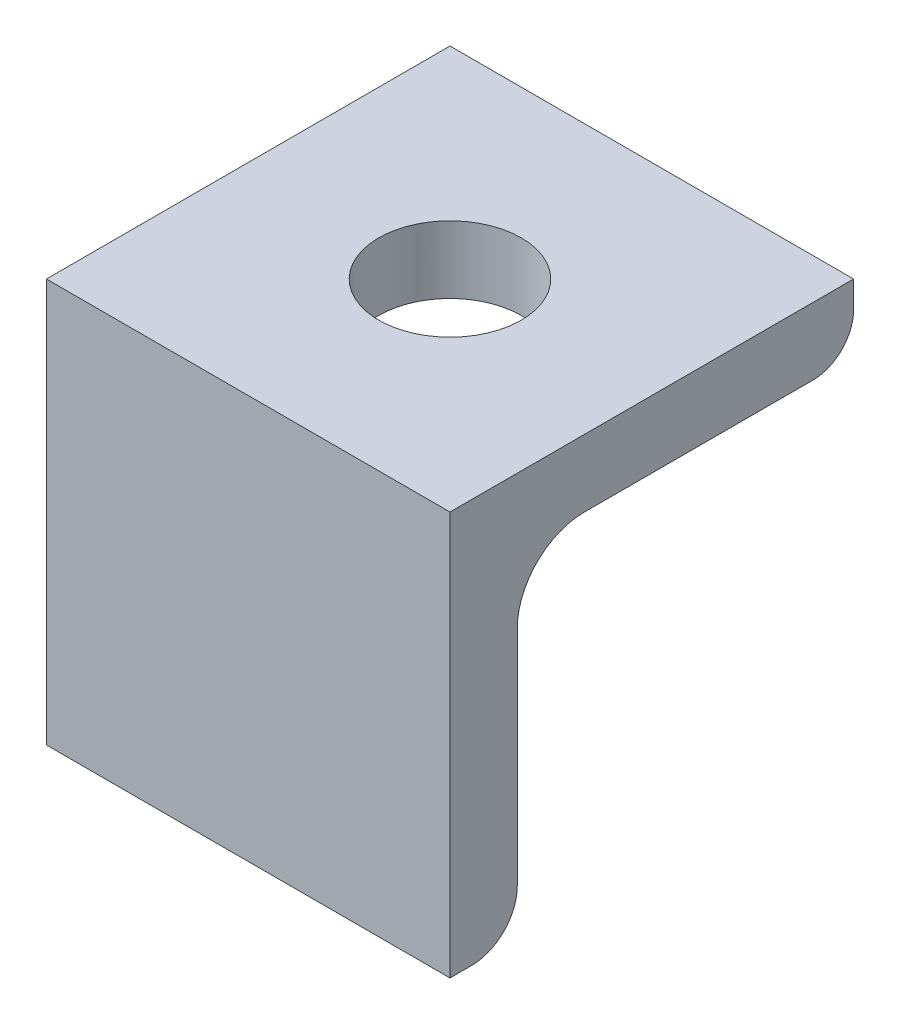
ISO-10303-21;
HEADER;
FILE_DESCRIPTION(('STEP AP214'),'2;1');
FILE_NAME('part.step','',(''),(''),'','','');
FILE_SCHEMA(('AUTOMOTIVE_DESIGN { 1 0 10303 214 1 1 1 1 }'));
ENDSEC;
DATA;
#1=APPLICATION_CONTEXT('core data for automotive mechanical design processes');
#2=APPLICATION_PROTOCOL_DEFINITION('international standard','automotive_design',2000,#1);
#3=PRODUCT_CONTEXT('',#1,'mechanical');
#4=PRODUCT('Part','Part','',(#3));
#5=PRODUCT_RELATED_PRODUCT_CATEGORY('part','',(#4));
#6=PRODUCT_DEFINITION_FORMATION('','',#4);
#7=PRODUCT_DEFINITION_CONTEXT('part definition',#1,'design');
#8=PRODUCT_DEFINITION('design','',#6,#7);
#9=PRODUCT_DEFINITION_SHAPE('','',#8);
#10=(LENGTH_UNIT() NAMED_UNIT(*) SI_UNIT(.MILLI.,.METRE.));
#11=(NAMED_UNIT(*) PLANE_ANGLE_UNIT() SI_UNIT($,.RADIAN.));
#12=(NAMED_UNIT(*) SI_UNIT($,.STERADIAN.) SOLID_ANGLE_UNIT());
#13=UNCERTAINTY_MEASURE_WITH_UNIT(LENGTH_MEASURE(1.E-05),#10,'distance_accuracy_value','');
#14=(GEOMETRIC_REPRESENTATION_CONTEXT(3) GLOBAL_UNCERTAINTY_ASSIGNED_CONTEXT((#13)) GLOBAL_UNIT_ASSIGNED_CONTEXT((#10,
#11,#12)) REPRESENTATION_CONTEXT('',''));
#15=CARTESIAN_POINT('',(0.,0.,0.));
#16=DIRECTION('',(0.,0.,1.));
#17=DIRECTION('',(1.,0.,0.));
#18=AXIS2_PLACEMENT_3D('',#15,#16,#17);
#19=CARTESIAN_POINT('',(0.,-3.175,0.));
#20=DIRECTION('',(0.,-1.,0.));
#21=DIRECTION('',(0.,0.,-1.));
#22=AXIS2_PLACEMENT_3D('',#19,#20,#21);
#23=PLANE('',#22);
#24=DIRECTION('',(1.,0.,0.));
#25=VECTOR('',#24,1.);
#26=CARTESIAN_POINT('',(-24.83358,-3.175,-6.35));
#27=LINE('',#26,#25);
#28=CARTESIAN_POINT('',(10.641228135284,-3.175,-6.35));
#29=VERTEX_POINT('',#28);
#30=CARTESIAN_POINT('',(8.40877186471604,-3.175,-6.35));
#31=VERTEX_POINT('',#30);
#32=EDGE_CURVE('E104',#29,#31,#27,.F.);
#33=ORIENTED_EDGE('',*,*,#32,.T.);
#34=CARTESIAN_POINT('',(9.525,-3.175,-9.525));
#35=DIRECTION('',(0.,-1.,0.));
#36=DIRECTION('',(0.,0.,-1.));
#37=AXIS2_PLACEMENT_3D('',#34,#35,#36);
#38=CIRCLE('',#37,3.3655);
#39=EDGE_CURVE('E19',#31,#29,#38,.F.);
#40=ORIENTED_EDGE('',*,*,#39,.T.);
#41=EDGE_LOOP('',(#33,#40));
#42=FACE_BOUND('',#41,.T.);
#43=ADVANCED_FACE('F16',(#42),#23,.F.);
#44=CARTESIAN_POINT('',(0.,-3.175,-19.05));
#45=DIRECTION('',(0.,0.,-1.));
#46=DIRECTION('',(-1.,0.,0.));
#47=AXIS2_PLACEMENT_3D('',#44,#45,#46);
#48=PLANE('',#47);
#49=DIRECTION('',(0.,1.,0.));
#50=VECTOR('',#49,1.);
#51=CARTESIAN_POINT('',(19.05,0.,-19.05));
#52=LINE('',#51,#50);
#53=CARTESIAN_POINT('',(19.05,-1.27,-19.05));
#54=VERTEX_POINT('',#53);
#55=CARTESIAN_POINT('',(19.05,0.,-19.05));
#56=VERTEX_POINT('',#55);
#57=EDGE_CURVE('E131',#54,#56,#52,.T.);
#58=ORIENTED_EDGE('',*,*,#57,.F.);
#59=DIRECTION('',(-1.,0.,0.));
#60=VECTOR('',#59,1.);
#61=CARTESIAN_POINT('',(43.88358,-1.27,-19.05));
#62=LINE('',#61,#60);
#63=CARTESIAN_POINT('',(0.,-1.27,-19.05));
#64=VERTEX_POINT('',#63);
#65=EDGE_CURVE('E105',#64,#54,#62,.F.);
#66=ORIENTED_EDGE('',*,*,#65,.F.);
#67=DIRECTION('',(0.,1.,0.));
#68=VECTOR('',#67,1.);
#69=CARTESIAN_POINT('',(0.,-3.175,-19.05));
#70=LINE('',#69,#68);
#71=CARTESIAN_POINT('',(0.,0.,-19.05));
#72=VERTEX_POINT('',#71);
#73=EDGE_CURVE('E106',#64,#72,#70,.T.);
#74=ORIENTED_EDGE('',*,*,#73,.T.);
#75=DIRECTION('',(1.,0.,0.));
#76=VECTOR('',#75,1.);
#77=CARTESIAN_POINT('',(0.,0.,-19.05));
#78=LINE('',#77,#76);
#79=EDGE_CURVE('E147',#56,#72,#78,.F.);
#80=ORIENTED_EDGE('',*,*,#79,.F.);
#81=EDGE_LOOP('',(#58,#66,#74,#80));
#82=FACE_BOUND('',#81,.T.);
#83=ADVANCED_FACE('F210',(#82),#48,.T.);
#84=CARTESIAN_POINT('',(9.525,-3.175,-9.525));
#85=DIRECTION('',(0.,-1.,0.));
#86=DIRECTION('',(0.,0.,-1.));
#87=AXIS2_PLACEMENT_3D('',#84,#85,#86);
#88=CYLINDRICAL_SURFACE('',#87,3.3655);
#89=CARTESIAN_POINT('',(9.525,-3.175,-9.525));
#90=DIRECTION('',(0.,-1.,0.));
#91=DIRECTION('',(0.,0.,-1.));
#92=AXIS2_PLACEMENT_3D('',#89,#90,#91);
#93=CIRCLE('',#92,3.3655);
#94=EDGE_CURVE('E92',#29,#31,#93,.F.);
#95=ORIENTED_EDGE('',*,*,#94,.F.);
#96=ORIENTED_EDGE('',*,*,#39,.F.);
#97=EDGE_LOOP('',(#95,#96));
#98=FACE_BOUND('',#97,.T.);
#99=CARTESIAN_POINT('',(9.525,0.,-9.525));
#100=DIRECTION('',(0.,-1.,0.));
#101=DIRECTION('',(0.,0.,-1.));
#102=AXIS2_PLACEMENT_3D('',#99,#100,#101);
#103=CIRCLE('',#102,3.3655);
#104=CARTESIAN_POINT('',(9.525,0.,-12.8905));
#105=VERTEX_POINT('',#104);
#106=EDGE_CURVE('E149',#105,#105,#103,.T.);
#107=ORIENTED_EDGE('',*,*,#106,.F.);
#108=EDGE_LOOP('',(#107));
#109=FACE_BOUND('',#108,.T.);
#110=ADVANCED_FACE('F97',(#98,#109),#88,.F.);
#111=CARTESIAN_POINT('',(43.88358,-1.27,-17.145));
#112=DIRECTION('',(-1.,0.,0.));
#113=DIRECTION('',(0.,0.,1.));
#114=AXIS2_PLACEMENT_3D('',#111,#112,#113);
#115=CYLINDRICAL_SURFACE('',#114,1.905);
#116=DIRECTION('',(1.,0.,0.));
#117=VECTOR('',#116,1.);
#118=CARTESIAN_POINT('',(0.,-3.175,-17.145));
#119=LINE('',#118,#117);
#120=CARTESIAN_POINT('',(0.,-3.175,-17.145));
#121=VERTEX_POINT('',#120);
#122=CARTESIAN_POINT('',(19.05,-3.175,-17.145));
#123=VERTEX_POINT('',#122);
#124=EDGE_CURVE('E119',#121,#123,#119,.T.);
#125=ORIENTED_EDGE('',*,*,#124,.F.);
#126=CARTESIAN_POINT('',(0.,-1.27,-17.145));
#127=DIRECTION('',(-1.,0.,0.));
#128=DIRECTION('',(0.,0.,1.));
#129=AXIS2_PLACEMENT_3D('',#126,#127,#128);
#130=CIRCLE('',#129,1.905);
#131=EDGE_CURVE('E163',#121,#64,#130,.F.);
#132=ORIENTED_EDGE('',*,*,#131,.T.);
#133=ORIENTED_EDGE('',*,*,#65,.T.);
#134=CARTESIAN_POINT('',(19.05,-1.27,-17.145));
#135=DIRECTION('',(-1.,0.,0.));
#136=DIRECTION('',(0.,0.,1.));
#137=AXIS2_PLACEMENT_3D('',#134,#135,#136);
#138=CIRCLE('',#137,1.905);
#139=EDGE_CURVE('E155',#123,#54,#138,.F.);
#140=ORIENTED_EDGE('',*,*,#139,.F.);
#141=EDGE_LOOP('',(#125,#132,#133,#140));
#142=FACE_BOUND('',#141,.T.);
#143=ADVANCED_FACE('F228',(#142),#115,.T.);
#144=CARTESIAN_POINT('',(43.88358,-16.891,-1.016));
#145=DIRECTION('',(-1.,0.,0.));
#146=DIRECTION('',(0.,0.,1.));
#147=AXIS2_PLACEMENT_3D('',#144,#145,#146);
#148=CYLINDRICAL_SURFACE('',#147,2.159);
#149=DIRECTION('',(1.,0.,0.));
#150=VECTOR('',#149,1.);
#151=CARTESIAN_POINT('',(0.,-19.05,-1.016));
#152=LINE('',#151,#150);
#153=CARTESIAN_POINT('',(0.,-19.05,-1.016));
#154=VERTEX_POINT('',#153);
#155=CARTESIAN_POINT('',(19.05,-19.05,-1.016));
#156=VERTEX_POINT('',#155);
#157=EDGE_CURVE('E100',#154,#156,#152,.T.);
#158=ORIENTED_EDGE('',*,*,#157,.F.);
#159=CARTESIAN_POINT('',(0.,-16.891,-1.016));
#160=DIRECTION('',(-1.,0.,0.));
#161=DIRECTION('',(0.,0.,1.));
#162=AXIS2_PLACEMENT_3D('',#159,#160,#161);
#163=CIRCLE('',#162,2.159);
#164=CARTESIAN_POINT('',(0.,-16.891,-3.175));
#165=VERTEX_POINT('',#164);
#166=EDGE_CURVE('E169',#154,#165,#163,.F.);
#167=ORIENTED_EDGE('',*,*,#166,.T.);
#168=DIRECTION('',(-1.,0.,0.));
#169=VECTOR('',#168,1.);
#170=CARTESIAN_POINT('',(0.,-16.891,-3.175));
#171=LINE('',#170,#169);
#172=CARTESIAN_POINT('',(19.05,-16.891,-3.175));
#173=VERTEX_POINT('',#172);
#174=EDGE_CURVE('E113',#173,#165,#171,.T.);
#175=ORIENTED_EDGE('',*,*,#174,.F.);
#176=CARTESIAN_POINT('',(19.05,-16.891,-1.016));
#177=DIRECTION('',(-1.,0.,0.));
#178=DIRECTION('',(0.,0.,1.));
#179=AXIS2_PLACEMENT_3D('',#176,#177,#178);
#180=CIRCLE('',#179,2.159);
#181=EDGE_CURVE('E180',#156,#173,#180,.F.);
#182=ORIENTED_EDGE('',*,*,#181,.F.);
#183=EDGE_LOOP('',(#158,#167,#175,#182));
#184=FACE_BOUND('',#183,.T.);
#185=ADVANCED_FACE('F222',(#184),#148,.T.);
#186=CARTESIAN_POINT('',(0.,-19.05,-3.175));
#187=DIRECTION('',(0.,0.,-1.));
#188=DIRECTION('',(-1.,0.,0.));
#189=AXIS2_PLACEMENT_3D('',#186,#187,#188);
#190=PLANE('',#189);
#191=DIRECTION('',(0.,1.,0.));
#192=VECTOR('',#191,1.);
#193=CARTESIAN_POINT('',(19.05,0.,-3.175));
#194=LINE('',#193,#192);
#195=CARTESIAN_POINT('',(19.05,-6.35,-3.175));
#196=VERTEX_POINT('',#195);
#197=EDGE_CURVE('E179',#173,#196,#194,.T.);
#198=ORIENTED_EDGE('',*,*,#197,.F.);
#199=ORIENTED_EDGE('',*,*,#174,.T.);
#200=DIRECTION('',(0.,1.,0.));
#201=VECTOR('',#200,1.);
#202=CARTESIAN_POINT('',(0.,0.,-3.175));
#203=LINE('',#202,#201);
#204=CARTESIAN_POINT('',(0.,-6.35,-3.175));
#205=VERTEX_POINT('',#204);
#206=EDGE_CURVE('E168',#165,#205,#203,.T.);
#207=ORIENTED_EDGE('',*,*,#206,.T.);
#208=DIRECTION('',(1.,0.,0.));
#209=VECTOR('',#208,1.);
#210=CARTESIAN_POINT('',(-24.83358,-6.35,-3.175));
#211=LINE('',#210,#209);
#212=EDGE_CURVE('E112',#205,#196,#211,.T.);
#213=ORIENTED_EDGE('',*,*,#212,.T.);
#214=EDGE_LOOP('',(#198,#199,#207,#213));
#215=FACE_BOUND('',#214,.T.);
#216=ADVANCED_FACE('F225',(#215),#190,.T.);
#217=CARTESIAN_POINT('',(-24.83358,-6.35,-6.35));
#218=DIRECTION('',(1.,0.,0.));
#219=DIRECTION('',(0.,0.,-1.));
#220=AXIS2_PLACEMENT_3D('',#217,#218,#219);
#221=CYLINDRICAL_SURFACE('',#220,3.175);
#222=CARTESIAN_POINT('',(19.05,-6.35,-6.35));
#223=DIRECTION('',(1.,0.,0.));
#224=DIRECTION('',(0.,0.,-1.));
#225=AXIS2_PLACEMENT_3D('',#222,#223,#224);
#226=CIRCLE('',#225,3.175);
#227=CARTESIAN_POINT('',(19.05,-3.175,-6.35));
#228=VERTEX_POINT('',#227);
#229=EDGE_CURVE('E177',#196,#228,#226,.F.);
#230=ORIENTED_EDGE('',*,*,#229,.F.);
#231=ORIENTED_EDGE('',*,*,#212,.F.);
#232=CARTESIAN_POINT('',(0.,-6.35,-6.35));
#233=DIRECTION('',(1.,0.,0.));
#234=DIRECTION('',(0.,0.,-1.));
#235=AXIS2_PLACEMENT_3D('',#232,#233,#234);
#236=CIRCLE('',#235,3.175);
#237=CARTESIAN_POINT('',(0.,-3.175,-6.35));
#238=VERTEX_POINT('',#237);
#239=EDGE_CURVE('E166',#205,#238,#236,.F.);
#240=ORIENTED_EDGE('',*,*,#239,.T.);
#241=DIRECTION('',(1.,0.,0.));
#242=VECTOR('',#241,1.);
#243=CARTESIAN_POINT('',(0.,-3.175,-6.35));
#244=LINE('',#243,#242);
#245=EDGE_CURVE('E111',#31,#238,#244,.F.);
#246=ORIENTED_EDGE('',*,*,#245,.F.);
#247=ORIENTED_EDGE('',*,*,#32,.F.);
#248=DIRECTION('',(1.,0.,0.));
#249=VECTOR('',#248,1.);
#250=CARTESIAN_POINT('',(0.,-3.175,-6.35));
#251=LINE('',#250,#249);
#252=EDGE_CURVE('E101',#228,#29,#251,.F.);
#253=ORIENTED_EDGE('',*,*,#252,.F.);
#254=EDGE_LOOP('',(#230,#231,#240,#246,#247,#253));
#255=FACE_BOUND('',#254,.T.);
#256=ADVANCED_FACE('F109',(#255),#221,.F.);
#257=CARTESIAN_POINT('',(0.,-3.175,-3.175));
#258=DIRECTION('',(0.,-1.,0.));
#259=DIRECTION('',(0.,0.,-1.));
#260=AXIS2_PLACEMENT_3D('',#257,#258,#259);
#261=PLANE('',#260);
#262=ORIENTED_EDGE('',*,*,#252,.T.);
#263=ORIENTED_EDGE('',*,*,#94,.T.);
#264=ORIENTED_EDGE('',*,*,#245,.T.);
#265=DIRECTION('',(0.,0.,-1.));
#266=VECTOR('',#265,1.);
#267=CARTESIAN_POINT('',(0.,-3.175,0.));
#268=LINE('',#267,#266);
#269=EDGE_CURVE('E136',#238,#121,#268,.T.);
#270=ORIENTED_EDGE('',*,*,#269,.T.);
#271=ORIENTED_EDGE('',*,*,#124,.T.);
#272=DIRECTION('',(0.,0.,-1.));
#273=VECTOR('',#272,1.);
#274=CARTESIAN_POINT('',(19.05,-3.175,0.));
#275=LINE('',#274,#273);
#276=EDGE_CURVE('E117',#228,#123,#275,.T.);
#277=ORIENTED_EDGE('',*,*,#276,.F.);
#278=EDGE_LOOP('',(#262,#263,#264,#270,#271,#277));
#279=FACE_BOUND('',#278,.T.);
#280=ADVANCED_FACE('F115',(#279),#261,.T.);
#281=CARTESIAN_POINT('',(0.,-19.05,0.));
#282=DIRECTION('',(0.,-1.,0.));
#283=DIRECTION('',(0.,0.,-1.));
#284=AXIS2_PLACEMENT_3D('',#281,#282,#283);
#285=PLANE('',#284);
#286=DIRECTION('',(0.,0.,-1.));
#287=VECTOR('',#286,1.);
#288=CARTESIAN_POINT('',(0.,-19.05,0.));
#289=LINE('',#288,#287);
#290=CARTESIAN_POINT('',(0.,-19.05,0.));
#291=VERTEX_POINT('',#290);
#292=EDGE_CURVE('E162',#291,#154,#289,.T.);
#293=ORIENTED_EDGE('',*,*,#292,.T.);
#294=ORIENTED_EDGE('',*,*,#157,.T.);
#295=DIRECTION('',(0.,0.,-1.));
#296=VECTOR('',#295,1.);
#297=CARTESIAN_POINT('',(19.05,-19.05,0.));
#298=LINE('',#297,#296);
#299=CARTESIAN_POINT('',(19.05,-19.05,0.));
#300=VERTEX_POINT('',#299);
#301=EDGE_CURVE('E182',#300,#156,#298,.T.);
#302=ORIENTED_EDGE('',*,*,#301,.F.);
#303=DIRECTION('',(1.,0.,0.));
#304=VECTOR('',#303,1.);
#305=CARTESIAN_POINT('',(0.,-19.05,0.));
#306=LINE('',#305,#304);
#307=EDGE_CURVE('E132',#291,#300,#306,.T.);
#308=ORIENTED_EDGE('',*,*,#307,.F.);
#309=EDGE_LOOP('',(#293,#294,#302,#308));
#310=FACE_BOUND('',#309,.T.);
#311=ADVANCED_FACE('F220',(#310),#285,.T.);
#312=CARTESIAN_POINT('',(19.05,0.,0.));
#313=DIRECTION('',(1.,0.,0.));
#314=DIRECTION('',(0.,0.,-1.));
#315=AXIS2_PLACEMENT_3D('',#312,#313,#314);
#316=PLANE('',#315);
#317=ORIENTED_EDGE('',*,*,#276,.T.);
#318=ORIENTED_EDGE('',*,*,#139,.T.);
#319=ORIENTED_EDGE('',*,*,#57,.T.);
#320=DIRECTION('',(0.,0.,1.));
#321=VECTOR('',#320,1.);
#322=CARTESIAN_POINT('',(19.05,0.,-19.05));
#323=LINE('',#322,#321);
#324=CARTESIAN_POINT('',(19.05,0.,0.));
#325=VERTEX_POINT('',#324);
#326=EDGE_CURVE('E150',#325,#56,#323,.F.);
#327=ORIENTED_EDGE('',*,*,#326,.F.);
#328=DIRECTION('',(0.,1.,0.));
#329=VECTOR('',#328,1.);
#330=CARTESIAN_POINT('',(19.05,0.,0.));
#331=LINE('',#330,#329);
#332=EDGE_CURVE('E135',#300,#325,#331,.T.);
#333=ORIENTED_EDGE('',*,*,#332,.F.);
#334=ORIENTED_EDGE('',*,*,#301,.T.);
#335=ORIENTED_EDGE('',*,*,#181,.T.);
#336=ORIENTED_EDGE('',*,*,#197,.T.);
#337=ORIENTED_EDGE('',*,*,#229,.T.);
#338=EDGE_LOOP('',(#317,#318,#319,#327,#333,#334,#335,#336,#337));
#339=FACE_BOUND('',#338,.T.);
#340=ADVANCED_FACE('F206',(#339),#316,.T.);
#341=CARTESIAN_POINT('',(0.,0.,-19.05));
#342=DIRECTION('',(0.,1.,0.));
#343=DIRECTION('',(0.,0.,1.));
#344=AXIS2_PLACEMENT_3D('',#341,#342,#343);
#345=PLANE('',#344);
#346=ORIENTED_EDGE('',*,*,#106,.T.);
#347=EDGE_LOOP('',(#346));
#348=FACE_BOUND('',#347,.T.);
#349=ORIENTED_EDGE('',*,*,#79,.T.);
#350=DIRECTION('',(0.,0.,-1.));
#351=VECTOR('',#350,1.);
#352=CARTESIAN_POINT('',(0.,0.,0.));
#353=LINE('',#352,#351);
#354=CARTESIAN_POINT('',(0.,0.,0.));
#355=VERTEX_POINT('',#354);
#356=EDGE_CURVE('E34',#72,#355,#353,.F.);
#357=ORIENTED_EDGE('',*,*,#356,.T.);
#358=DIRECTION('',(1.,0.,0.));
#359=VECTOR('',#358,1.);
#360=CARTESIAN_POINT('',(0.,0.,0.));
#361=LINE('',#360,#359);
#362=EDGE_CURVE('E25',#325,#355,#361,.F.);
#363=ORIENTED_EDGE('',*,*,#362,.F.);
#364=ORIENTED_EDGE('',*,*,#326,.T.);
#365=EDGE_LOOP('',(#349,#357,#363,#364));
#366=FACE_BOUND('',#365,.T.);
#367=ADVANCED_FACE('F204',(#348,#366),#345,.T.);
#368=CARTESIAN_POINT('',(0.,0.,0.));
#369=DIRECTION('',(1.,0.,0.));
#370=DIRECTION('',(0.,0.,-1.));
#371=AXIS2_PLACEMENT_3D('',#368,#369,#370);
#372=PLANE('',#371);
#373=ORIENTED_EDGE('',*,*,#239,.F.);
#374=ORIENTED_EDGE('',*,*,#206,.F.);
#375=ORIENTED_EDGE('',*,*,#166,.F.);
#376=ORIENTED_EDGE('',*,*,#292,.F.);
#377=DIRECTION('',(0.,1.,0.));
#378=VECTOR('',#377,1.);
#379=CARTESIAN_POINT('',(0.,0.,0.));
#380=LINE('',#379,#378);
#381=EDGE_CURVE('E11',#355,#291,#380,.F.);
#382=ORIENTED_EDGE('',*,*,#381,.F.);
#383=ORIENTED_EDGE('',*,*,#356,.F.);
#384=ORIENTED_EDGE('',*,*,#73,.F.);
#385=ORIENTED_EDGE('',*,*,#131,.F.);
#386=ORIENTED_EDGE('',*,*,#269,.F.);
#387=EDGE_LOOP('',(#373,#374,#375,#376,#382,#383,#384,#385,#386));
#388=FACE_BOUND('',#387,.T.);
#389=ADVANCED_FACE('F214',(#388),#372,.F.);
#390=CARTESIAN_POINT('',(0.,0.,0.));
#391=DIRECTION('',(0.,0.,1.));
#392=DIRECTION('',(1.,0.,0.));
#393=AXIS2_PLACEMENT_3D('',#390,#391,#392);
#394=PLANE('',#393);
#395=ORIENTED_EDGE('',*,*,#362,.T.);
#396=ORIENTED_EDGE('',*,*,#381,.T.);
#397=ORIENTED_EDGE('',*,*,#307,.T.);
#398=ORIENTED_EDGE('',*,*,#332,.T.);
#399=EDGE_LOOP('',(#395,#396,#397,#398));
#400=FACE_BOUND('',#399,.T.);
#401=ADVANCED_FACE('F203',(#400),#394,.T.);
#402=CLOSED_SHELL('',(#43,#83,#110,#143,#185,#216,#256,#280,#311,#340,#367,#389,#401));
#403=MANIFOLD_SOLID_BREP('B1',#402);
#404=ADVANCED_BREP_SHAPE_REPRESENTATION('',(#18,#403),#14);
#405=SHAPE_DEFINITION_REPRESENTATION(#9,#404);
ENDSEC;
END-ISO-10303-21;
